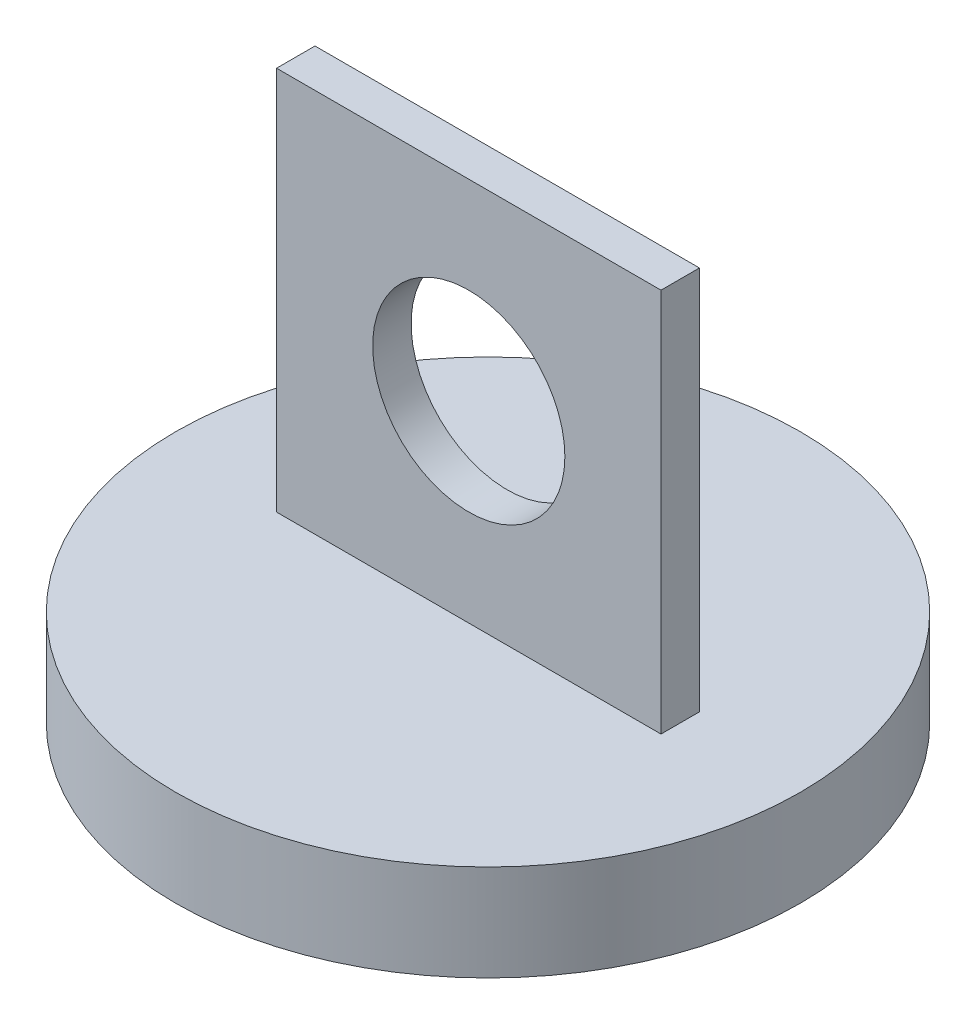
ISO-10303-21;
HEADER;
FILE_DESCRIPTION(('STEP AP214'),'2;1');
FILE_NAME('part.step','',(''),(''),'','','');
FILE_SCHEMA(('AUTOMOTIVE_DESIGN { 1 0 10303 214 1 1 1 1 }'));
ENDSEC;
DATA;
#1=APPLICATION_CONTEXT('core data for automotive mechanical design processes');
#2=APPLICATION_PROTOCOL_DEFINITION('international standard','automotive_design',2000,#1);
#3=PRODUCT_CONTEXT('',#1,'mechanical');
#4=PRODUCT('Part','Part','',(#3));
#5=PRODUCT_RELATED_PRODUCT_CATEGORY('part','',(#4));
#6=PRODUCT_DEFINITION_FORMATION('','',#4);
#7=PRODUCT_DEFINITION_CONTEXT('part definition',#1,'design');
#8=PRODUCT_DEFINITION('design','',#6,#7);
#9=PRODUCT_DEFINITION_SHAPE('','',#8);
#10=(LENGTH_UNIT() NAMED_UNIT(*) SI_UNIT(.MILLI.,.METRE.));
#11=(NAMED_UNIT(*) PLANE_ANGLE_UNIT() SI_UNIT($,.RADIAN.));
#12=(NAMED_UNIT(*) SI_UNIT($,.STERADIAN.) SOLID_ANGLE_UNIT());
#13=UNCERTAINTY_MEASURE_WITH_UNIT(LENGTH_MEASURE(1.E-05),#10,'distance_accuracy_value','');
#14=(GEOMETRIC_REPRESENTATION_CONTEXT(3) GLOBAL_UNCERTAINTY_ASSIGNED_CONTEXT((#13)) GLOBAL_UNIT_ASSIGNED_CONTEXT((#10,
#11,#12)) REPRESENTATION_CONTEXT('',''));
#15=CARTESIAN_POINT('',(0.,0.,0.));
#16=DIRECTION('',(0.,0.,1.));
#17=DIRECTION('',(1.,0.,0.));
#18=AXIS2_PLACEMENT_3D('',#15,#16,#17);
#19=CARTESIAN_POINT('',(0.,10.,0.));
#20=DIRECTION('',(0.,1.,0.));
#21=DIRECTION('',(0.,0.,1.));
#22=AXIS2_PLACEMENT_3D('',#19,#20,#21);
#23=PLANE('',#22);
#24=CARTESIAN_POINT('',(0.,10.,0.));
#25=DIRECTION('',(0.,1.,0.));
#26=DIRECTION('',(0.,0.,1.));
#27=AXIS2_PLACEMENT_3D('',#24,#25,#26);
#28=CIRCLE('',#27,32.5);
#29=CARTESIAN_POINT('',(0.,10.,32.5));
#30=VERTEX_POINT('',#29);
#31=EDGE_CURVE('E11',#30,#30,#28,.T.);
#32=ORIENTED_EDGE('',*,*,#31,.T.);
#33=EDGE_LOOP('',(#32));
#34=FACE_BOUND('',#33,.T.);
#35=DIRECTION('',(1.,0.,0.));
#36=VECTOR('',#35,1.);
#37=CARTESIAN_POINT('',(20.,10.,2.));
#38=LINE('',#37,#36);
#39=CARTESIAN_POINT('',(-20.,10.,2.));
#40=VERTEX_POINT('',#39);
#41=CARTESIAN_POINT('',(20.,10.,2.));
#42=VERTEX_POINT('',#41);
#43=EDGE_CURVE('E101',#40,#42,#38,.T.);
#44=ORIENTED_EDGE('',*,*,#43,.F.);
#45=DIRECTION('',(0.,0.,1.));
#46=VECTOR('',#45,1.);
#47=CARTESIAN_POINT('',(-20.,10.,-2.));
#48=LINE('',#47,#46);
#49=CARTESIAN_POINT('',(-20.,10.,-2.));
#50=VERTEX_POINT('',#49);
#51=EDGE_CURVE('E115',#50,#40,#48,.T.);
#52=ORIENTED_EDGE('',*,*,#51,.F.);
#53=DIRECTION('',(-1.,0.,0.));
#54=VECTOR('',#53,1.);
#55=CARTESIAN_POINT('',(20.,10.,-2.));
#56=LINE('',#55,#54);
#57=CARTESIAN_POINT('',(20.,10.,-2.));
#58=VERTEX_POINT('',#57);
#59=EDGE_CURVE('E81',#58,#50,#56,.T.);
#60=ORIENTED_EDGE('',*,*,#59,.F.);
#61=DIRECTION('',(0.,0.,-1.));
#62=VECTOR('',#61,1.);
#63=CARTESIAN_POINT('',(20.,10.,-2.));
#64=LINE('',#63,#62);
#65=EDGE_CURVE('E121',#42,#58,#64,.T.);
#66=ORIENTED_EDGE('',*,*,#65,.F.);
#67=EDGE_LOOP('',(#44,#52,#60,#66));
#68=FACE_BOUND('',#67,.T.);
#69=ADVANCED_FACE('F41',(#34,#68),#23,.T.);
#70=CARTESIAN_POINT('',(0.,10.,0.));
#71=DIRECTION('',(0.,-1.,0.));
#72=DIRECTION('',(0.,0.,-1.));
#73=AXIS2_PLACEMENT_3D('',#70,#71,#72);
#74=CYLINDRICAL_SURFACE('',#73,32.5);
#75=ORIENTED_EDGE('',*,*,#31,.F.);
#76=EDGE_LOOP('',(#75));
#77=FACE_BOUND('',#76,.T.);
#78=CARTESIAN_POINT('',(0.,0.,0.));
#79=DIRECTION('',(0.,1.,0.));
#80=DIRECTION('',(0.,0.,1.));
#81=AXIS2_PLACEMENT_3D('',#78,#79,#80);
#82=CIRCLE('',#81,32.5);
#83=CARTESIAN_POINT('',(0.,0.,32.5));
#84=VERTEX_POINT('',#83);
#85=EDGE_CURVE('E51',#84,#84,#82,.T.);
#86=ORIENTED_EDGE('',*,*,#85,.T.);
#87=EDGE_LOOP('',(#86));
#88=FACE_BOUND('',#87,.T.);
#89=ADVANCED_FACE('F43',(#77,#88),#74,.T.);
#90=CARTESIAN_POINT('',(0.,0.,0.));
#91=DIRECTION('',(0.,1.,0.));
#92=DIRECTION('',(0.,0.,1.));
#93=AXIS2_PLACEMENT_3D('',#90,#91,#92);
#94=PLANE('',#93);
#95=ORIENTED_EDGE('',*,*,#85,.F.);
#96=EDGE_LOOP('',(#95));
#97=FACE_BOUND('',#96,.T.);
#98=ADVANCED_FACE('F136',(#97),#94,.F.);
#99=CARTESIAN_POINT('',(-20.,50.,-2.));
#100=DIRECTION('',(1.,0.,0.));
#101=DIRECTION('',(0.,0.,-1.));
#102=AXIS2_PLACEMENT_3D('',#99,#100,#101);
#103=PLANE('',#102);
#104=ORIENTED_EDGE('',*,*,#51,.T.);
#105=DIRECTION('',(0.,-1.,0.));
#106=VECTOR('',#105,1.);
#107=CARTESIAN_POINT('',(-20.,50.,2.));
#108=LINE('',#107,#106);
#109=CARTESIAN_POINT('',(-20.,50.,2.));
#110=VERTEX_POINT('',#109);
#111=EDGE_CURVE('E105',#110,#40,#108,.T.);
#112=ORIENTED_EDGE('',*,*,#111,.F.);
#113=DIRECTION('',(0.,0.,1.));
#114=VECTOR('',#113,1.);
#115=CARTESIAN_POINT('',(-20.,50.,-2.));
#116=LINE('',#115,#114);
#117=CARTESIAN_POINT('',(-20.,50.,-2.));
#118=VERTEX_POINT('',#117);
#119=EDGE_CURVE('E93',#118,#110,#116,.T.);
#120=ORIENTED_EDGE('',*,*,#119,.F.);
#121=DIRECTION('',(0.,-1.,0.));
#122=VECTOR('',#121,1.);
#123=CARTESIAN_POINT('',(-20.,50.,-2.));
#124=LINE('',#123,#122);
#125=EDGE_CURVE('E111',#118,#50,#124,.T.);
#126=ORIENTED_EDGE('',*,*,#125,.T.);
#127=EDGE_LOOP('',(#104,#112,#120,#126));
#128=FACE_BOUND('',#127,.T.);
#129=ADVANCED_FACE('F138',(#128),#103,.F.);
#130=CARTESIAN_POINT('',(20.,50.,2.));
#131=DIRECTION('',(0.,0.,-1.));
#132=DIRECTION('',(-1.,0.,0.));
#133=AXIS2_PLACEMENT_3D('',#130,#131,#132);
#134=PLANE('',#133);
#135=CARTESIAN_POINT('',(0.,30.,2.));
#136=DIRECTION('',(0.,0.,1.));
#137=DIRECTION('',(1.,0.,0.));
#138=AXIS2_PLACEMENT_3D('',#135,#136,#137);
#139=CIRCLE('',#138,10.);
#140=CARTESIAN_POINT('',(10.,30.,2.));
#141=VERTEX_POINT('',#140);
#142=EDGE_CURVE('E172',#141,#141,#139,.T.);
#143=ORIENTED_EDGE('',*,*,#142,.F.);
#144=EDGE_LOOP('',(#143));
#145=FACE_BOUND('',#144,.T.);
#146=ORIENTED_EDGE('',*,*,#43,.T.);
#147=DIRECTION('',(0.,-1.,0.));
#148=VECTOR('',#147,1.);
#149=CARTESIAN_POINT('',(20.,50.,2.));
#150=LINE('',#149,#148);
#151=CARTESIAN_POINT('',(20.,50.,2.));
#152=VERTEX_POINT('',#151);
#153=EDGE_CURVE('E98',#152,#42,#150,.T.);
#154=ORIENTED_EDGE('',*,*,#153,.F.);
#155=DIRECTION('',(1.,0.,0.));
#156=VECTOR('',#155,1.);
#157=CARTESIAN_POINT('',(20.,50.,2.));
#158=LINE('',#157,#156);
#159=EDGE_CURVE('E88',#110,#152,#158,.T.);
#160=ORIENTED_EDGE('',*,*,#159,.F.);
#161=ORIENTED_EDGE('',*,*,#111,.T.);
#162=EDGE_LOOP('',(#146,#154,#160,#161));
#163=FACE_BOUND('',#162,.T.);
#164=ADVANCED_FACE('F99',(#145,#163),#134,.F.);
#165=CARTESIAN_POINT('',(20.,50.,-2.));
#166=DIRECTION('',(-1.,0.,0.));
#167=DIRECTION('',(0.,0.,1.));
#168=AXIS2_PLACEMENT_3D('',#165,#166,#167);
#169=PLANE('',#168);
#170=ORIENTED_EDGE('',*,*,#65,.T.);
#171=DIRECTION('',(0.,-1.,0.));
#172=VECTOR('',#171,1.);
#173=CARTESIAN_POINT('',(20.,50.,-2.));
#174=LINE('',#173,#172);
#175=CARTESIAN_POINT('',(20.,50.,-2.));
#176=VERTEX_POINT('',#175);
#177=EDGE_CURVE('E59',#176,#58,#174,.T.);
#178=ORIENTED_EDGE('',*,*,#177,.F.);
#179=DIRECTION('',(0.,0.,-1.));
#180=VECTOR('',#179,1.);
#181=CARTESIAN_POINT('',(20.,50.,-2.));
#182=LINE('',#181,#180);
#183=EDGE_CURVE('E91',#152,#176,#182,.T.);
#184=ORIENTED_EDGE('',*,*,#183,.F.);
#185=ORIENTED_EDGE('',*,*,#153,.T.);
#186=EDGE_LOOP('',(#170,#178,#184,#185));
#187=FACE_BOUND('',#186,.T.);
#188=ADVANCED_FACE('F107',(#187),#169,.F.);
#189=CARTESIAN_POINT('',(20.,50.,-2.));
#190=DIRECTION('',(0.,0.,1.));
#191=DIRECTION('',(1.,0.,0.));
#192=AXIS2_PLACEMENT_3D('',#189,#190,#191);
#193=PLANE('',#192);
#194=CARTESIAN_POINT('',(0.,30.,-2.));
#195=DIRECTION('',(0.,0.,1.));
#196=DIRECTION('',(1.,0.,0.));
#197=AXIS2_PLACEMENT_3D('',#194,#195,#196);
#198=CIRCLE('',#197,10.);
#199=CARTESIAN_POINT('',(10.,30.,-2.));
#200=VERTEX_POINT('',#199);
#201=EDGE_CURVE('E45',#200,#200,#198,.T.);
#202=ORIENTED_EDGE('',*,*,#201,.T.);
#203=EDGE_LOOP('',(#202));
#204=FACE_BOUND('',#203,.T.);
#205=ORIENTED_EDGE('',*,*,#59,.T.);
#206=ORIENTED_EDGE('',*,*,#125,.F.);
#207=DIRECTION('',(-1.,0.,0.));
#208=VECTOR('',#207,1.);
#209=CARTESIAN_POINT('',(20.,50.,-2.));
#210=LINE('',#209,#208);
#211=EDGE_CURVE('E67',#176,#118,#210,.T.);
#212=ORIENTED_EDGE('',*,*,#211,.F.);
#213=ORIENTED_EDGE('',*,*,#177,.T.);
#214=EDGE_LOOP('',(#205,#206,#212,#213));
#215=FACE_BOUND('',#214,.T.);
#216=ADVANCED_FACE('F158',(#204,#215),#193,.F.);
#217=CARTESIAN_POINT('',(0.,50.,0.));
#218=DIRECTION('',(0.,-1.,0.));
#219=DIRECTION('',(0.,0.,-1.));
#220=AXIS2_PLACEMENT_3D('',#217,#218,#219);
#221=PLANE('',#220);
#222=ORIENTED_EDGE('',*,*,#119,.T.);
#223=ORIENTED_EDGE('',*,*,#159,.T.);
#224=ORIENTED_EDGE('',*,*,#183,.T.);
#225=ORIENTED_EDGE('',*,*,#211,.T.);
#226=EDGE_LOOP('',(#222,#223,#224,#225));
#227=FACE_BOUND('',#226,.T.);
#228=ADVANCED_FACE('F89',(#227),#221,.F.);
#229=CARTESIAN_POINT('',(0.,30.,-38.));
#230=DIRECTION('',(0.,0.,1.));
#231=DIRECTION('',(1.,0.,0.));
#232=AXIS2_PLACEMENT_3D('',#229,#230,#231);
#233=CYLINDRICAL_SURFACE('',#232,10.);
#234=ORIENTED_EDGE('',*,*,#142,.T.);
#235=EDGE_LOOP('',(#234));
#236=FACE_BOUND('',#235,.T.);
#237=ORIENTED_EDGE('',*,*,#201,.F.);
#238=EDGE_LOOP('',(#237));
#239=FACE_BOUND('',#238,.T.);
#240=ADVANCED_FACE('F164',(#236,#239),#233,.F.);
#241=CLOSED_SHELL('',(#69,#89,#98,#129,#164,#188,#216,#228,#240));
#242=MANIFOLD_SOLID_BREP('B2',#241);
#243=ADVANCED_BREP_SHAPE_REPRESENTATION('',(#18,#242),#14);
#244=SHAPE_DEFINITION_REPRESENTATION(#9,#243);
ENDSEC;
END-ISO-10303-21;
